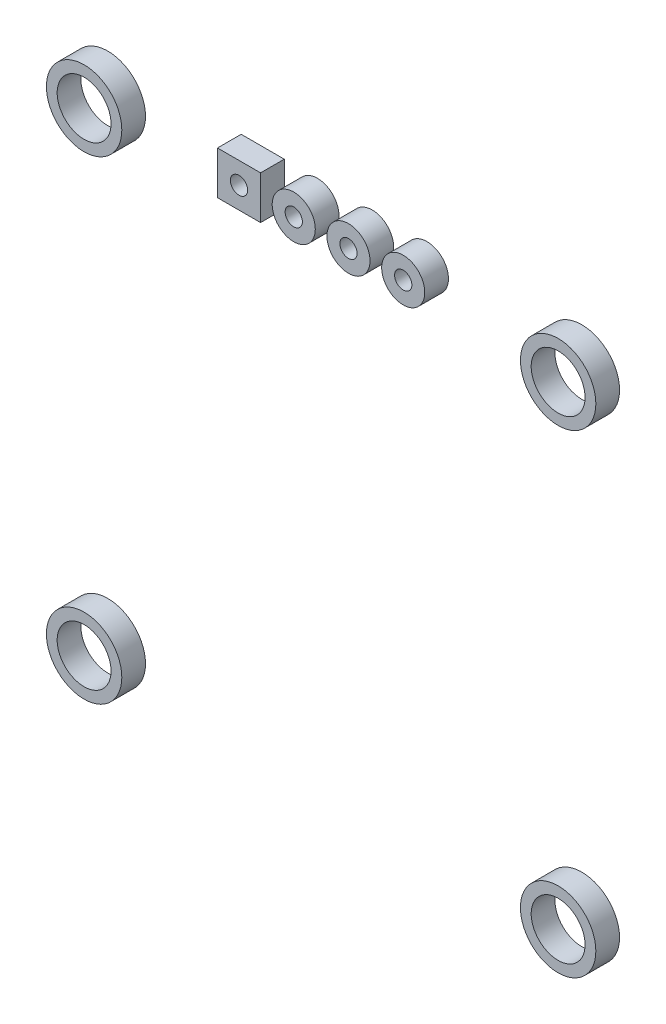
ISO-10303-21;
HEADER;
FILE_DESCRIPTION(('STEP AP214'),'2;1');
FILE_NAME('part.step','',(''),(''),'','','');
FILE_SCHEMA(('AUTOMOTIVE_DESIGN { 1 0 10303 214 1 1 1 1 }'));
ENDSEC;
DATA;
#1=APPLICATION_CONTEXT('core data for automotive mechanical design processes');
#2=APPLICATION_PROTOCOL_DEFINITION('international standard','automotive_design',2000,#1);
#3=PRODUCT_CONTEXT('',#1,'mechanical');
#4=PRODUCT('Part','Part','',(#3));
#5=PRODUCT_RELATED_PRODUCT_CATEGORY('part','',(#4));
#6=PRODUCT_DEFINITION_FORMATION('','',#4);
#7=PRODUCT_DEFINITION_CONTEXT('part definition',#1,'design');
#8=PRODUCT_DEFINITION('design','',#6,#7);
#9=PRODUCT_DEFINITION_SHAPE('','',#8);
#10=(LENGTH_UNIT() NAMED_UNIT(*) SI_UNIT(.MILLI.,.METRE.));
#11=(NAMED_UNIT(*) PLANE_ANGLE_UNIT() SI_UNIT($,.RADIAN.));
#12=(NAMED_UNIT(*) SI_UNIT($,.STERADIAN.) SOLID_ANGLE_UNIT());
#13=UNCERTAINTY_MEASURE_WITH_UNIT(LENGTH_MEASURE(1.E-05),#10,'distance_accuracy_value','');
#14=(GEOMETRIC_REPRESENTATION_CONTEXT(3) GLOBAL_UNCERTAINTY_ASSIGNED_CONTEXT((#13)) GLOBAL_UNIT_ASSIGNED_CONTEXT((#10,
#11,#12)) REPRESENTATION_CONTEXT('',''));
#15=CARTESIAN_POINT('',(0.,0.,0.));
#16=DIRECTION('',(0.,0.,1.));
#17=DIRECTION('',(1.,0.,0.));
#18=AXIS2_PLACEMENT_3D('',#15,#16,#17);
#19=CARTESIAN_POINT('',(-0.113336493286,3.892335302933,1.1));
#20=DIRECTION('',(0.,0.,1.));
#21=DIRECTION('',(1.,0.,0.));
#22=AXIS2_PLACEMENT_3D('',#19,#20,#21);
#23=PLANE('',#22);
#24=CARTESIAN_POINT('',(11.,-11.,1.1));
#25=DIRECTION('',(0.,0.,1.));
#26=DIRECTION('',(1.,0.,0.));
#27=AXIS2_PLACEMENT_3D('',#24,#25,#26);
#28=CIRCLE('',#27,1.25);
#29=CARTESIAN_POINT('',(12.25,-11.,1.1));
#30=VERTEX_POINT('',#29);
#31=EDGE_CURVE('P0_E22',#30,#30,#28,.T.);
#32=ORIENTED_EDGE('',*,*,#31,.F.);
#33=EDGE_LOOP('',(#32));
#34=FACE_BOUND('',#33,.T.);
#35=CARTESIAN_POINT('',(11.,-11.,1.1));
#36=DIRECTION('',(0.,0.,1.));
#37=DIRECTION('',(1.,0.,0.));
#38=AXIS2_PLACEMENT_3D('',#35,#36,#37);
#39=CIRCLE('',#38,1.75);
#40=CARTESIAN_POINT('',(12.75,-11.,1.1));
#41=VERTEX_POINT('',#40);
#42=EDGE_CURVE('P0_E33',#41,#41,#39,.T.);
#43=ORIENTED_EDGE('',*,*,#42,.T.);
#44=EDGE_LOOP('',(#43));
#45=FACE_BOUND('',#44,.T.);
#46=ADVANCED_FACE('P0_F15',(#34,#45),#23,.T.);
#47=CARTESIAN_POINT('',(-0.113336493286,3.892335302933,0.));
#48=DIRECTION('',(0.,0.,1.));
#49=DIRECTION('',(1.,0.,0.));
#50=AXIS2_PLACEMENT_3D('',#47,#48,#49);
#51=PLANE('',#50);
#52=CARTESIAN_POINT('',(11.,-11.,0.));
#53=DIRECTION('',(0.,0.,1.));
#54=DIRECTION('',(1.,0.,0.));
#55=AXIS2_PLACEMENT_3D('',#52,#53,#54);
#56=CIRCLE('',#55,1.25);
#57=CARTESIAN_POINT('',(12.25,-11.,0.));
#58=VERTEX_POINT('',#57);
#59=EDGE_CURVE('P0_E10',#58,#58,#56,.T.);
#60=ORIENTED_EDGE('',*,*,#59,.T.);
#61=EDGE_LOOP('',(#60));
#62=FACE_BOUND('',#61,.T.);
#63=CARTESIAN_POINT('',(11.,-11.,0.));
#64=DIRECTION('',(0.,0.,1.));
#65=DIRECTION('',(1.,0.,0.));
#66=AXIS2_PLACEMENT_3D('',#63,#64,#65);
#67=CIRCLE('',#66,1.75);
#68=CARTESIAN_POINT('',(12.75,-11.,0.));
#69=VERTEX_POINT('',#68);
#70=EDGE_CURVE('P0_E36',#69,#69,#67,.T.);
#71=ORIENTED_EDGE('',*,*,#70,.F.);
#72=EDGE_LOOP('',(#71));
#73=FACE_BOUND('',#72,.T.);
#74=ADVANCED_FACE('P0_F47',(#62,#73),#51,.F.);
#75=CARTESIAN_POINT('',(11.,-11.,0.));
#76=DIRECTION('',(0.,0.,-1.));
#77=DIRECTION('',(1.,0.,0.));
#78=AXIS2_PLACEMENT_3D('',#75,#76,#77);
#79=CYLINDRICAL_SURFACE('',#78,1.25);
#80=ORIENTED_EDGE('',*,*,#31,.T.);
#81=EDGE_LOOP('',(#80));
#82=FACE_BOUND('',#81,.T.);
#83=ORIENTED_EDGE('',*,*,#59,.F.);
#84=EDGE_LOOP('',(#83));
#85=FACE_BOUND('',#84,.T.);
#86=ADVANCED_FACE('P0_F51',(#82,#85),#79,.F.);
#87=CARTESIAN_POINT('',(11.,-11.,0.));
#88=DIRECTION('',(0.,0.,-1.));
#89=DIRECTION('',(1.,0.,0.));
#90=AXIS2_PLACEMENT_3D('',#87,#88,#89);
#91=CYLINDRICAL_SURFACE('',#90,1.75);
#92=ORIENTED_EDGE('',*,*,#42,.F.);
#93=EDGE_LOOP('',(#92));
#94=FACE_BOUND('',#93,.T.);
#95=ORIENTED_EDGE('',*,*,#70,.T.);
#96=EDGE_LOOP('',(#95));
#97=FACE_BOUND('',#96,.T.);
#98=ADVANCED_FACE('P0_F50',(#94,#97),#91,.T.);
#99=CLOSED_SHELL('',(#46,#74,#86,#98));
#100=MANIFOLD_SOLID_BREP('P0_B1',#99);
#101=CARTESIAN_POINT('',(-0.113336493286,3.892335302933,1.1));
#102=DIRECTION('',(0.,0.,1.));
#103=DIRECTION('',(1.,0.,0.));
#104=AXIS2_PLACEMENT_3D('',#101,#102,#103);
#105=PLANE('',#104);
#106=CARTESIAN_POINT('',(-11.,-11.,1.1));
#107=DIRECTION('',(0.,0.,1.));
#108=DIRECTION('',(1.,0.,0.));
#109=AXIS2_PLACEMENT_3D('',#106,#107,#108);
#110=CIRCLE('',#109,1.25);
#111=CARTESIAN_POINT('',(-9.75,-11.,1.1));
#112=VERTEX_POINT('',#111);
#113=EDGE_CURVE('P1_E23',#112,#112,#110,.T.);
#114=ORIENTED_EDGE('',*,*,#113,.F.);
#115=EDGE_LOOP('',(#114));
#116=FACE_BOUND('',#115,.T.);
#117=CARTESIAN_POINT('',(-11.,-11.,1.1));
#118=DIRECTION('',(0.,0.,1.));
#119=DIRECTION('',(1.,0.,0.));
#120=AXIS2_PLACEMENT_3D('',#117,#118,#119);
#121=CIRCLE('',#120,1.75);
#122=CARTESIAN_POINT('',(-9.25,-11.,1.1));
#123=VERTEX_POINT('',#122);
#124=EDGE_CURVE('P1_E18',#123,#123,#121,.T.);
#125=ORIENTED_EDGE('',*,*,#124,.T.);
#126=EDGE_LOOP('',(#125));
#127=FACE_BOUND('',#126,.T.);
#128=ADVANCED_FACE('P1_F15',(#116,#127),#105,.T.);
#129=CARTESIAN_POINT('',(-0.113336493286,3.892335302933,0.));
#130=DIRECTION('',(0.,0.,1.));
#131=DIRECTION('',(1.,0.,0.));
#132=AXIS2_PLACEMENT_3D('',#129,#130,#131);
#133=PLANE('',#132);
#134=CARTESIAN_POINT('',(-11.,-11.,0.));
#135=DIRECTION('',(0.,0.,1.));
#136=DIRECTION('',(1.,0.,0.));
#137=AXIS2_PLACEMENT_3D('',#134,#135,#136);
#138=CIRCLE('',#137,1.25);
#139=CARTESIAN_POINT('',(-9.75,-11.,0.));
#140=VERTEX_POINT('',#139);
#141=EDGE_CURVE('P1_E10',#140,#140,#138,.T.);
#142=ORIENTED_EDGE('',*,*,#141,.T.);
#143=EDGE_LOOP('',(#142));
#144=FACE_BOUND('',#143,.T.);
#145=CARTESIAN_POINT('',(-11.,-11.,0.));
#146=DIRECTION('',(0.,0.,1.));
#147=DIRECTION('',(1.,0.,0.));
#148=AXIS2_PLACEMENT_3D('',#145,#146,#147);
#149=CIRCLE('',#148,1.75);
#150=CARTESIAN_POINT('',(-9.25,-11.,0.));
#151=VERTEX_POINT('',#150);
#152=EDGE_CURVE('P1_E35',#151,#151,#149,.T.);
#153=ORIENTED_EDGE('',*,*,#152,.F.);
#154=EDGE_LOOP('',(#153));
#155=FACE_BOUND('',#154,.T.);
#156=ADVANCED_FACE('P1_F57',(#144,#155),#133,.F.);
#157=CARTESIAN_POINT('',(-11.,-11.,0.));
#158=DIRECTION('',(0.,0.,-1.));
#159=DIRECTION('',(1.,0.,0.));
#160=AXIS2_PLACEMENT_3D('',#157,#158,#159);
#161=CYLINDRICAL_SURFACE('',#160,1.25);
#162=ORIENTED_EDGE('',*,*,#113,.T.);
#163=EDGE_LOOP('',(#162));
#164=FACE_BOUND('',#163,.T.);
#165=ORIENTED_EDGE('',*,*,#141,.F.);
#166=EDGE_LOOP('',(#165));
#167=FACE_BOUND('',#166,.T.);
#168=ADVANCED_FACE('P1_F49',(#164,#167),#161,.F.);
#169=CARTESIAN_POINT('',(-11.,-11.,0.));
#170=DIRECTION('',(0.,0.,-1.));
#171=DIRECTION('',(1.,0.,0.));
#172=AXIS2_PLACEMENT_3D('',#169,#170,#171);
#173=CYLINDRICAL_SURFACE('',#172,1.75);
#174=ORIENTED_EDGE('',*,*,#124,.F.);
#175=EDGE_LOOP('',(#174));
#176=FACE_BOUND('',#175,.T.);
#177=ORIENTED_EDGE('',*,*,#152,.T.);
#178=EDGE_LOOP('',(#177));
#179=FACE_BOUND('',#178,.T.);
#180=ADVANCED_FACE('P1_F48',(#176,#179),#173,.T.);
#181=CLOSED_SHELL('',(#128,#156,#168,#180));
#182=MANIFOLD_SOLID_BREP('P1_B1',#181);
#183=CARTESIAN_POINT('',(-0.113336493286,3.892335302933,1.1));
#184=DIRECTION('',(0.,0.,1.));
#185=DIRECTION('',(1.,0.,0.));
#186=AXIS2_PLACEMENT_3D('',#183,#184,#185);
#187=PLANE('',#186);
#188=CARTESIAN_POINT('',(11.,11.,1.1));
#189=DIRECTION('',(0.,0.,1.));
#190=DIRECTION('',(1.,0.,0.));
#191=AXIS2_PLACEMENT_3D('',#188,#189,#190);
#192=CIRCLE('',#191,1.25);
#193=CARTESIAN_POINT('',(12.25,11.,1.1));
#194=VERTEX_POINT('',#193);
#195=EDGE_CURVE('P2_E18',#194,#194,#192,.T.);
#196=ORIENTED_EDGE('',*,*,#195,.F.);
#197=EDGE_LOOP('',(#196));
#198=FACE_BOUND('',#197,.T.);
#199=CARTESIAN_POINT('',(11.,11.,1.1));
#200=DIRECTION('',(0.,0.,1.));
#201=DIRECTION('',(1.,0.,0.));
#202=AXIS2_PLACEMENT_3D('',#199,#200,#201);
#203=CIRCLE('',#202,1.75);
#204=CARTESIAN_POINT('',(12.75,11.,1.1));
#205=VERTEX_POINT('',#204);
#206=EDGE_CURVE('P2_E33',#205,#205,#203,.T.);
#207=ORIENTED_EDGE('',*,*,#206,.T.);
#208=EDGE_LOOP('',(#207));
#209=FACE_BOUND('',#208,.T.);
#210=ADVANCED_FACE('P2_F15',(#198,#209),#187,.T.);
#211=CARTESIAN_POINT('',(-0.113336493286,3.892335302933,0.));
#212=DIRECTION('',(0.,0.,1.));
#213=DIRECTION('',(1.,0.,0.));
#214=AXIS2_PLACEMENT_3D('',#211,#212,#213);
#215=PLANE('',#214);
#216=CARTESIAN_POINT('',(11.,11.,0.));
#217=DIRECTION('',(0.,0.,1.));
#218=DIRECTION('',(1.,0.,0.));
#219=AXIS2_PLACEMENT_3D('',#216,#217,#218);
#220=CIRCLE('',#219,1.25);
#221=CARTESIAN_POINT('',(12.25,11.,0.));
#222=VERTEX_POINT('',#221);
#223=EDGE_CURVE('P2_E10',#222,#222,#220,.T.);
#224=ORIENTED_EDGE('',*,*,#223,.T.);
#225=EDGE_LOOP('',(#224));
#226=FACE_BOUND('',#225,.T.);
#227=CARTESIAN_POINT('',(11.,11.,0.));
#228=DIRECTION('',(0.,0.,1.));
#229=DIRECTION('',(1.,0.,0.));
#230=AXIS2_PLACEMENT_3D('',#227,#228,#229);
#231=CIRCLE('',#230,1.75);
#232=CARTESIAN_POINT('',(12.75,11.,0.));
#233=VERTEX_POINT('',#232);
#234=EDGE_CURVE('P2_E38',#233,#233,#231,.T.);
#235=ORIENTED_EDGE('',*,*,#234,.F.);
#236=EDGE_LOOP('',(#235));
#237=FACE_BOUND('',#236,.T.);
#238=ADVANCED_FACE('P2_F44',(#226,#237),#215,.F.);
#239=CARTESIAN_POINT('',(11.,11.,0.));
#240=DIRECTION('',(0.,0.,-1.));
#241=DIRECTION('',(1.,0.,0.));
#242=AXIS2_PLACEMENT_3D('',#239,#240,#241);
#243=CYLINDRICAL_SURFACE('',#242,1.25);
#244=ORIENTED_EDGE('',*,*,#195,.T.);
#245=EDGE_LOOP('',(#244));
#246=FACE_BOUND('',#245,.T.);
#247=ORIENTED_EDGE('',*,*,#223,.F.);
#248=EDGE_LOOP('',(#247));
#249=FACE_BOUND('',#248,.T.);
#250=ADVANCED_FACE('P2_F50',(#246,#249),#243,.F.);
#251=CARTESIAN_POINT('',(11.,11.,0.));
#252=DIRECTION('',(0.,0.,-1.));
#253=DIRECTION('',(1.,0.,0.));
#254=AXIS2_PLACEMENT_3D('',#251,#252,#253);
#255=CYLINDRICAL_SURFACE('',#254,1.75);
#256=ORIENTED_EDGE('',*,*,#206,.F.);
#257=EDGE_LOOP('',(#256));
#258=FACE_BOUND('',#257,.T.);
#259=ORIENTED_EDGE('',*,*,#234,.T.);
#260=EDGE_LOOP('',(#259));
#261=FACE_BOUND('',#260,.T.);
#262=ADVANCED_FACE('P2_F43',(#258,#261),#255,.T.);
#263=CLOSED_SHELL('',(#210,#238,#250,#262));
#264=MANIFOLD_SOLID_BREP('P2_B1',#263);
#265=CARTESIAN_POINT('',(-0.113336493286,3.892335302933,1.1));
#266=DIRECTION('',(0.,0.,1.));
#267=DIRECTION('',(1.,0.,0.));
#268=AXIS2_PLACEMENT_3D('',#265,#266,#267);
#269=PLANE('',#268);
#270=CARTESIAN_POINT('',(-11.,11.,1.1));
#271=DIRECTION('',(0.,0.,1.));
#272=DIRECTION('',(1.,0.,0.));
#273=AXIS2_PLACEMENT_3D('',#270,#271,#272);
#274=CIRCLE('',#273,1.25);
#275=CARTESIAN_POINT('',(-9.75,11.,1.1));
#276=VERTEX_POINT('',#275);
#277=EDGE_CURVE('P3_E22',#276,#276,#274,.T.);
#278=ORIENTED_EDGE('',*,*,#277,.F.);
#279=EDGE_LOOP('',(#278));
#280=FACE_BOUND('',#279,.T.);
#281=CARTESIAN_POINT('',(-11.,11.,1.1));
#282=DIRECTION('',(0.,0.,1.));
#283=DIRECTION('',(1.,0.,0.));
#284=AXIS2_PLACEMENT_3D('',#281,#282,#283);
#285=CIRCLE('',#284,1.75);
#286=CARTESIAN_POINT('',(-9.25,11.,1.1));
#287=VERTEX_POINT('',#286);
#288=EDGE_CURVE('P3_E33',#287,#287,#285,.T.);
#289=ORIENTED_EDGE('',*,*,#288,.T.);
#290=EDGE_LOOP('',(#289));
#291=FACE_BOUND('',#290,.T.);
#292=ADVANCED_FACE('P3_F15',(#280,#291),#269,.T.);
#293=CARTESIAN_POINT('',(-0.113336493286,3.892335302933,0.));
#294=DIRECTION('',(0.,0.,1.));
#295=DIRECTION('',(1.,0.,0.));
#296=AXIS2_PLACEMENT_3D('',#293,#294,#295);
#297=PLANE('',#296);
#298=CARTESIAN_POINT('',(-11.,11.,0.));
#299=DIRECTION('',(0.,0.,1.));
#300=DIRECTION('',(1.,0.,0.));
#301=AXIS2_PLACEMENT_3D('',#298,#299,#300);
#302=CIRCLE('',#301,1.25);
#303=CARTESIAN_POINT('',(-9.75,11.,0.));
#304=VERTEX_POINT('',#303);
#305=EDGE_CURVE('P3_E10',#304,#304,#302,.T.);
#306=ORIENTED_EDGE('',*,*,#305,.T.);
#307=EDGE_LOOP('',(#306));
#308=FACE_BOUND('',#307,.T.);
#309=CARTESIAN_POINT('',(-11.,11.,0.));
#310=DIRECTION('',(0.,0.,1.));
#311=DIRECTION('',(1.,0.,0.));
#312=AXIS2_PLACEMENT_3D('',#309,#310,#311);
#313=CIRCLE('',#312,1.75);
#314=CARTESIAN_POINT('',(-9.25,11.,0.));
#315=VERTEX_POINT('',#314);
#316=EDGE_CURVE('P3_E39',#315,#315,#313,.T.);
#317=ORIENTED_EDGE('',*,*,#316,.F.);
#318=EDGE_LOOP('',(#317));
#319=FACE_BOUND('',#318,.T.);
#320=ADVANCED_FACE('P3_F47',(#308,#319),#297,.F.);
#321=CARTESIAN_POINT('',(-11.,11.,0.));
#322=DIRECTION('',(0.,0.,-1.));
#323=DIRECTION('',(1.,0.,0.));
#324=AXIS2_PLACEMENT_3D('',#321,#322,#323);
#325=CYLINDRICAL_SURFACE('',#324,1.25);
#326=ORIENTED_EDGE('',*,*,#277,.T.);
#327=EDGE_LOOP('',(#326));
#328=FACE_BOUND('',#327,.T.);
#329=ORIENTED_EDGE('',*,*,#305,.F.);
#330=EDGE_LOOP('',(#329));
#331=FACE_BOUND('',#330,.T.);
#332=ADVANCED_FACE('P3_F51',(#328,#331),#325,.F.);
#333=CARTESIAN_POINT('',(-11.,11.,0.));
#334=DIRECTION('',(0.,0.,-1.));
#335=DIRECTION('',(1.,0.,0.));
#336=AXIS2_PLACEMENT_3D('',#333,#334,#335);
#337=CYLINDRICAL_SURFACE('',#336,1.75);
#338=ORIENTED_EDGE('',*,*,#288,.F.);
#339=EDGE_LOOP('',(#338));
#340=FACE_BOUND('',#339,.T.);
#341=ORIENTED_EDGE('',*,*,#316,.T.);
#342=EDGE_LOOP('',(#341));
#343=FACE_BOUND('',#342,.T.);
#344=ADVANCED_FACE('P3_F50',(#340,#343),#337,.T.);
#345=CLOSED_SHELL('',(#292,#320,#332,#344));
#346=MANIFOLD_SOLID_BREP('P3_B1',#345);
#347=CARTESIAN_POINT('',(-0.113336493286,3.892335302933,1.1));
#348=DIRECTION('',(0.,0.,1.));
#349=DIRECTION('',(1.,0.,0.));
#350=AXIS2_PLACEMENT_3D('',#347,#348,#349);
#351=PLANE('',#350);
#352=CARTESIAN_POINT('',(3.81,11.5,1.1));
#353=DIRECTION('',(0.,0.,1.));
#354=DIRECTION('',(1.,0.,0.));
#355=AXIS2_PLACEMENT_3D('',#352,#353,#354);
#356=CIRCLE('',#355,0.4);
#357=CARTESIAN_POINT('',(4.21,11.5,1.1));
#358=VERTEX_POINT('',#357);
#359=EDGE_CURVE('P4_E22',#358,#358,#356,.T.);
#360=ORIENTED_EDGE('',*,*,#359,.F.);
#361=EDGE_LOOP('',(#360));
#362=FACE_BOUND('',#361,.T.);
#363=CARTESIAN_POINT('',(3.81,11.5,1.1));
#364=DIRECTION('',(0.,0.,1.));
#365=DIRECTION('',(1.,0.,0.));
#366=AXIS2_PLACEMENT_3D('',#363,#364,#365);
#367=CIRCLE('',#366,1.);
#368=CARTESIAN_POINT('',(4.81,11.5,1.1));
#369=VERTEX_POINT('',#368);
#370=EDGE_CURVE('P4_E33',#369,#369,#367,.T.);
#371=ORIENTED_EDGE('',*,*,#370,.T.);
#372=EDGE_LOOP('',(#371));
#373=FACE_BOUND('',#372,.T.);
#374=ADVANCED_FACE('P4_F15',(#362,#373),#351,.T.);
#375=CARTESIAN_POINT('',(-0.113336493286,3.892335302933,0.));
#376=DIRECTION('',(0.,0.,1.));
#377=DIRECTION('',(1.,0.,0.));
#378=AXIS2_PLACEMENT_3D('',#375,#376,#377);
#379=PLANE('',#378);
#380=CARTESIAN_POINT('',(3.81,11.5,0.));
#381=DIRECTION('',(0.,0.,1.));
#382=DIRECTION('',(1.,0.,0.));
#383=AXIS2_PLACEMENT_3D('',#380,#381,#382);
#384=CIRCLE('',#383,0.4);
#385=CARTESIAN_POINT('',(4.21,11.5,0.));
#386=VERTEX_POINT('',#385);
#387=EDGE_CURVE('P4_E10',#386,#386,#384,.T.);
#388=ORIENTED_EDGE('',*,*,#387,.T.);
#389=EDGE_LOOP('',(#388));
#390=FACE_BOUND('',#389,.T.);
#391=CARTESIAN_POINT('',(3.81,11.5,0.));
#392=DIRECTION('',(0.,0.,1.));
#393=DIRECTION('',(1.,0.,0.));
#394=AXIS2_PLACEMENT_3D('',#391,#392,#393);
#395=CIRCLE('',#394,1.);
#396=CARTESIAN_POINT('',(4.81,11.5,0.));
#397=VERTEX_POINT('',#396);
#398=EDGE_CURVE('P4_E36',#397,#397,#395,.T.);
#399=ORIENTED_EDGE('',*,*,#398,.F.);
#400=EDGE_LOOP('',(#399));
#401=FACE_BOUND('',#400,.T.);
#402=ADVANCED_FACE('P4_F47',(#390,#401),#379,.F.);
#403=CARTESIAN_POINT('',(3.81,11.5,0.));
#404=DIRECTION('',(0.,0.,-1.));
#405=DIRECTION('',(1.,0.,0.));
#406=AXIS2_PLACEMENT_3D('',#403,#404,#405);
#407=CYLINDRICAL_SURFACE('',#406,0.4);
#408=ORIENTED_EDGE('',*,*,#359,.T.);
#409=EDGE_LOOP('',(#408));
#410=FACE_BOUND('',#409,.T.);
#411=ORIENTED_EDGE('',*,*,#387,.F.);
#412=EDGE_LOOP('',(#411));
#413=FACE_BOUND('',#412,.T.);
#414=ADVANCED_FACE('P4_F51',(#410,#413),#407,.F.);
#415=CARTESIAN_POINT('',(3.81,11.5,0.));
#416=DIRECTION('',(0.,0.,-1.));
#417=DIRECTION('',(1.,0.,0.));
#418=AXIS2_PLACEMENT_3D('',#415,#416,#417);
#419=CYLINDRICAL_SURFACE('',#418,1.);
#420=ORIENTED_EDGE('',*,*,#370,.F.);
#421=EDGE_LOOP('',(#420));
#422=FACE_BOUND('',#421,.T.);
#423=ORIENTED_EDGE('',*,*,#398,.T.);
#424=EDGE_LOOP('',(#423));
#425=FACE_BOUND('',#424,.T.);
#426=ADVANCED_FACE('P4_F50',(#422,#425),#419,.T.);
#427=CLOSED_SHELL('',(#374,#402,#414,#426));
#428=MANIFOLD_SOLID_BREP('P4_B1',#427);
#429=CARTESIAN_POINT('',(-0.113336493286,3.892335302933,1.1));
#430=DIRECTION('',(0.,0.,1.));
#431=DIRECTION('',(1.,0.,0.));
#432=AXIS2_PLACEMENT_3D('',#429,#430,#431);
#433=PLANE('',#432);
#434=CARTESIAN_POINT('',(-3.81,11.5,1.1));
#435=DIRECTION('',(0.,0.,1.));
#436=DIRECTION('',(1.,0.,0.));
#437=AXIS2_PLACEMENT_3D('',#434,#435,#436);
#438=CIRCLE('',#437,0.4);
#439=CARTESIAN_POINT('',(-3.41,11.5,1.1));
#440=VERTEX_POINT('',#439);
#441=EDGE_CURVE('P5_E27',#440,#440,#438,.T.);
#442=ORIENTED_EDGE('',*,*,#441,.F.);
#443=EDGE_LOOP('',(#442));
#444=FACE_BOUND('',#443,.T.);
#445=DIRECTION('',(0.,1.,0.));
#446=VECTOR('',#445,1.);
#447=CARTESIAN_POINT('',(-4.81,10.5,1.1));
#448=LINE('',#447,#446);
#449=CARTESIAN_POINT('',(-4.81,10.5,1.1));
#450=VERTEX_POINT('',#449);
#451=CARTESIAN_POINT('',(-4.81,12.5,1.1));
#452=VERTEX_POINT('',#451);
#453=EDGE_CURVE('P5_E48',#450,#452,#448,.T.);
#454=ORIENTED_EDGE('',*,*,#453,.F.);
#455=DIRECTION('',(-1.,0.,0.));
#456=VECTOR('',#455,1.);
#457=CARTESIAN_POINT('',(-2.81,10.5,1.1));
#458=LINE('',#457,#456);
#459=CARTESIAN_POINT('',(-2.81,10.5,1.1));
#460=VERTEX_POINT('',#459);
#461=EDGE_CURVE('P5_E75',#460,#450,#458,.T.);
#462=ORIENTED_EDGE('',*,*,#461,.F.);
#463=DIRECTION('',(0.,-1.,0.));
#464=VECTOR('',#463,1.);
#465=CARTESIAN_POINT('',(-2.81,12.5,1.1));
#466=LINE('',#465,#464);
#467=CARTESIAN_POINT('',(-2.81,12.5,1.1));
#468=VERTEX_POINT('',#467);
#469=EDGE_CURVE('P5_E72',#468,#460,#466,.T.);
#470=ORIENTED_EDGE('',*,*,#469,.F.);
#471=DIRECTION('',(1.,0.,0.));
#472=VECTOR('',#471,1.);
#473=CARTESIAN_POINT('',(-4.81,12.5,1.1));
#474=LINE('',#473,#472);
#475=EDGE_CURVE('P5_E128',#452,#468,#474,.T.);
#476=ORIENTED_EDGE('',*,*,#475,.F.);
#477=EDGE_LOOP('',(#454,#462,#470,#476));
#478=FACE_BOUND('',#477,.T.);
#479=ADVANCED_FACE('P5_F17',(#444,#478),#433,.T.);
#480=CARTESIAN_POINT('',(-0.113336493286,3.892335302933,0.));
#481=DIRECTION('',(0.,0.,1.));
#482=DIRECTION('',(1.,0.,0.));
#483=AXIS2_PLACEMENT_3D('',#480,#481,#482);
#484=PLANE('',#483);
#485=CARTESIAN_POINT('',(-3.81,11.5,0.));
#486=DIRECTION('',(0.,0.,1.));
#487=DIRECTION('',(1.,0.,0.));
#488=AXIS2_PLACEMENT_3D('',#485,#486,#487);
#489=CIRCLE('',#488,0.4);
#490=CARTESIAN_POINT('',(-3.41,11.5,0.));
#491=VERTEX_POINT('',#490);
#492=EDGE_CURVE('P5_E11',#491,#491,#489,.T.);
#493=ORIENTED_EDGE('',*,*,#492,.T.);
#494=EDGE_LOOP('',(#493));
#495=FACE_BOUND('',#494,.T.);
#496=DIRECTION('',(1.,0.,0.));
#497=VECTOR('',#496,1.);
#498=CARTESIAN_POINT('',(-4.81,12.5,0.));
#499=LINE('',#498,#497);
#500=CARTESIAN_POINT('',(-4.81,12.5,0.));
#501=VERTEX_POINT('',#500);
#502=CARTESIAN_POINT('',(-2.81,12.5,0.));
#503=VERTEX_POINT('',#502);
#504=EDGE_CURVE('P5_E92',#501,#503,#499,.T.);
#505=ORIENTED_EDGE('',*,*,#504,.T.);
#506=DIRECTION('',(0.,-1.,0.));
#507=VECTOR('',#506,1.);
#508=CARTESIAN_POINT('',(-2.81,12.5,0.));
#509=LINE('',#508,#507);
#510=CARTESIAN_POINT('',(-2.81,10.5,0.));
#511=VERTEX_POINT('',#510);
#512=EDGE_CURVE('P5_E79',#503,#511,#509,.T.);
#513=ORIENTED_EDGE('',*,*,#512,.T.);
#514=DIRECTION('',(-1.,0.,0.));
#515=VECTOR('',#514,1.);
#516=CARTESIAN_POINT('',(-2.81,10.5,0.));
#517=LINE('',#516,#515);
#518=CARTESIAN_POINT('',(-4.81,10.5,0.));
#519=VERTEX_POINT('',#518);
#520=EDGE_CURVE('P5_E84',#511,#519,#517,.T.);
#521=ORIENTED_EDGE('',*,*,#520,.T.);
#522=DIRECTION('',(0.,1.,0.));
#523=VECTOR('',#522,1.);
#524=CARTESIAN_POINT('',(-4.81,10.5,0.));
#525=LINE('',#524,#523);
#526=EDGE_CURVE('P5_E20',#519,#501,#525,.T.);
#527=ORIENTED_EDGE('',*,*,#526,.T.);
#528=EDGE_LOOP('',(#505,#513,#521,#527));
#529=FACE_BOUND('',#528,.T.);
#530=ADVANCED_FACE('P5_F121',(#495,#529),#484,.F.);
#531=CARTESIAN_POINT('',(-3.81,11.5,0.));
#532=DIRECTION('',(0.,0.,-1.));
#533=DIRECTION('',(1.,0.,0.));
#534=AXIS2_PLACEMENT_3D('',#531,#532,#533);
#535=CYLINDRICAL_SURFACE('',#534,0.4);
#536=ORIENTED_EDGE('',*,*,#441,.T.);
#537=EDGE_LOOP('',(#536));
#538=FACE_BOUND('',#537,.T.);
#539=ORIENTED_EDGE('',*,*,#492,.F.);
#540=EDGE_LOOP('',(#539));
#541=FACE_BOUND('',#540,.T.);
#542=ADVANCED_FACE('P5_F183',(#538,#541),#535,.F.);
#543=CARTESIAN_POINT('',(-4.81,10.5,0.));
#544=DIRECTION('',(-1.,0.,0.));
#545=DIRECTION('',(0.,0.,1.));
#546=AXIS2_PLACEMENT_3D('',#543,#544,#545);
#547=PLANE('',#546);
#548=DIRECTION('',(0.,0.,1.));
#549=VECTOR('',#548,1.);
#550=CARTESIAN_POINT('',(-4.81,10.5,0.));
#551=LINE('',#550,#549);
#552=EDGE_CURVE('P5_E78',#519,#450,#551,.T.);
#553=ORIENTED_EDGE('',*,*,#552,.T.);
#554=ORIENTED_EDGE('',*,*,#453,.T.);
#555=DIRECTION('',(0.,0.,1.));
#556=VECTOR('',#555,1.);
#557=CARTESIAN_POINT('',(-4.81,12.5,0.));
#558=LINE('',#557,#556);
#559=EDGE_CURVE('P5_E124',#501,#452,#558,.T.);
#560=ORIENTED_EDGE('',*,*,#559,.F.);
#561=ORIENTED_EDGE('',*,*,#526,.F.);
#562=EDGE_LOOP('',(#553,#554,#560,#561));
#563=FACE_BOUND('',#562,.T.);
#564=ADVANCED_FACE('P5_F130',(#563),#547,.T.);
#565=CARTESIAN_POINT('',(-2.81,10.5,0.));
#566=DIRECTION('',(0.,-1.,0.));
#567=DIRECTION('',(0.,0.,-1.));
#568=AXIS2_PLACEMENT_3D('',#565,#566,#567);
#569=PLANE('',#568);
#570=DIRECTION('',(0.,0.,1.));
#571=VECTOR('',#570,1.);
#572=CARTESIAN_POINT('',(-2.81,10.5,0.));
#573=LINE('',#572,#571);
#574=EDGE_CURVE('P5_E83',#511,#460,#573,.T.);
#575=ORIENTED_EDGE('',*,*,#574,.T.);
#576=ORIENTED_EDGE('',*,*,#461,.T.);
#577=ORIENTED_EDGE('',*,*,#552,.F.);
#578=ORIENTED_EDGE('',*,*,#520,.F.);
#579=EDGE_LOOP('',(#575,#576,#577,#578));
#580=FACE_BOUND('',#579,.T.);
#581=ADVANCED_FACE('P5_F82',(#580),#569,.T.);
#582=CARTESIAN_POINT('',(-2.81,12.5,0.));
#583=DIRECTION('',(1.,0.,0.));
#584=DIRECTION('',(0.,1.,0.));
#585=AXIS2_PLACEMENT_3D('',#582,#583,#584);
#586=PLANE('',#585);
#587=DIRECTION('',(0.,0.,1.));
#588=VECTOR('',#587,1.);
#589=CARTESIAN_POINT('',(-2.81,12.5,0.));
#590=LINE('',#589,#588);
#591=EDGE_CURVE('P5_E95',#503,#468,#590,.T.);
#592=ORIENTED_EDGE('',*,*,#591,.T.);
#593=ORIENTED_EDGE('',*,*,#469,.T.);
#594=ORIENTED_EDGE('',*,*,#574,.F.);
#595=ORIENTED_EDGE('',*,*,#512,.F.);
#596=EDGE_LOOP('',(#592,#593,#594,#595));
#597=FACE_BOUND('',#596,.T.);
#598=ADVANCED_FACE('P5_F89',(#597),#586,.T.);
#599=CARTESIAN_POINT('',(-4.81,12.5,0.));
#600=DIRECTION('',(0.,1.,0.));
#601=DIRECTION('',(1.,0.,0.));
#602=AXIS2_PLACEMENT_3D('',#599,#600,#601);
#603=PLANE('',#602);
#604=ORIENTED_EDGE('',*,*,#559,.T.);
#605=ORIENTED_EDGE('',*,*,#475,.T.);
#606=ORIENTED_EDGE('',*,*,#591,.F.);
#607=ORIENTED_EDGE('',*,*,#504,.F.);
#608=EDGE_LOOP('',(#604,#605,#606,#607));
#609=FACE_BOUND('',#608,.T.);
#610=ADVANCED_FACE('P5_F122',(#609),#603,.T.);
#611=CLOSED_SHELL('',(#479,#530,#542,#564,#581,#598,#610));
#612=MANIFOLD_SOLID_BREP('P5_B1',#611);
#613=CARTESIAN_POINT('',(-0.113336493286,3.892335302933,1.1));
#614=DIRECTION('',(0.,0.,1.));
#615=DIRECTION('',(1.,0.,0.));
#616=AXIS2_PLACEMENT_3D('',#613,#614,#615);
#617=PLANE('',#616);
#618=CARTESIAN_POINT('',(-1.27,11.5,1.1));
#619=DIRECTION('',(0.,0.,1.));
#620=DIRECTION('',(1.,0.,0.));
#621=AXIS2_PLACEMENT_3D('',#618,#619,#620);
#622=CIRCLE('',#621,0.4);
#623=CARTESIAN_POINT('',(-0.87,11.5,1.1));
#624=VERTEX_POINT('',#623);
#625=EDGE_CURVE('P6_E22',#624,#624,#622,.T.);
#626=ORIENTED_EDGE('',*,*,#625,.F.);
#627=EDGE_LOOP('',(#626));
#628=FACE_BOUND('',#627,.T.);
#629=CARTESIAN_POINT('',(-1.27,11.5,1.1));
#630=DIRECTION('',(0.,0.,1.));
#631=DIRECTION('',(1.,0.,0.));
#632=AXIS2_PLACEMENT_3D('',#629,#630,#631);
#633=CIRCLE('',#632,1.);
#634=CARTESIAN_POINT('',(-0.27,11.5,1.1));
#635=VERTEX_POINT('',#634);
#636=EDGE_CURVE('P6_E33',#635,#635,#633,.T.);
#637=ORIENTED_EDGE('',*,*,#636,.T.);
#638=EDGE_LOOP('',(#637));
#639=FACE_BOUND('',#638,.T.);
#640=ADVANCED_FACE('P6_F15',(#628,#639),#617,.T.);
#641=CARTESIAN_POINT('',(-0.113336493286,3.892335302933,0.));
#642=DIRECTION('',(0.,0.,1.));
#643=DIRECTION('',(1.,0.,0.));
#644=AXIS2_PLACEMENT_3D('',#641,#642,#643);
#645=PLANE('',#644);
#646=CARTESIAN_POINT('',(-1.27,11.5,0.));
#647=DIRECTION('',(0.,0.,1.));
#648=DIRECTION('',(1.,0.,0.));
#649=AXIS2_PLACEMENT_3D('',#646,#647,#648);
#650=CIRCLE('',#649,0.4);
#651=CARTESIAN_POINT('',(-0.87,11.5,0.));
#652=VERTEX_POINT('',#651);
#653=EDGE_CURVE('P6_E10',#652,#652,#650,.T.);
#654=ORIENTED_EDGE('',*,*,#653,.T.);
#655=EDGE_LOOP('',(#654));
#656=FACE_BOUND('',#655,.T.);
#657=CARTESIAN_POINT('',(-1.27,11.5,0.));
#658=DIRECTION('',(0.,0.,1.));
#659=DIRECTION('',(1.,0.,0.));
#660=AXIS2_PLACEMENT_3D('',#657,#658,#659);
#661=CIRCLE('',#660,1.);
#662=CARTESIAN_POINT('',(-0.27,11.5,0.));
#663=VERTEX_POINT('',#662);
#664=EDGE_CURVE('P6_E36',#663,#663,#661,.T.);
#665=ORIENTED_EDGE('',*,*,#664,.F.);
#666=EDGE_LOOP('',(#665));
#667=FACE_BOUND('',#666,.T.);
#668=ADVANCED_FACE('P6_F47',(#656,#667),#645,.F.);
#669=CARTESIAN_POINT('',(-1.27,11.5,0.));
#670=DIRECTION('',(0.,0.,-1.));
#671=DIRECTION('',(1.,0.,0.));
#672=AXIS2_PLACEMENT_3D('',#669,#670,#671);
#673=CYLINDRICAL_SURFACE('',#672,0.4);
#674=ORIENTED_EDGE('',*,*,#625,.T.);
#675=EDGE_LOOP('',(#674));
#676=FACE_BOUND('',#675,.T.);
#677=ORIENTED_EDGE('',*,*,#653,.F.);
#678=EDGE_LOOP('',(#677));
#679=FACE_BOUND('',#678,.T.);
#680=ADVANCED_FACE('P6_F51',(#676,#679),#673,.F.);
#681=CARTESIAN_POINT('',(-1.27,11.5,0.));
#682=DIRECTION('',(0.,0.,-1.));
#683=DIRECTION('',(1.,0.,0.));
#684=AXIS2_PLACEMENT_3D('',#681,#682,#683);
#685=CYLINDRICAL_SURFACE('',#684,1.);
#686=ORIENTED_EDGE('',*,*,#636,.F.);
#687=EDGE_LOOP('',(#686));
#688=FACE_BOUND('',#687,.T.);
#689=ORIENTED_EDGE('',*,*,#664,.T.);
#690=EDGE_LOOP('',(#689));
#691=FACE_BOUND('',#690,.T.);
#692=ADVANCED_FACE('P6_F50',(#688,#691),#685,.T.);
#693=CLOSED_SHELL('',(#640,#668,#680,#692));
#694=MANIFOLD_SOLID_BREP('P6_B1',#693);
#695=CARTESIAN_POINT('',(-0.113336493286,3.892335302933,1.1));
#696=DIRECTION('',(0.,0.,1.));
#697=DIRECTION('',(1.,0.,0.));
#698=AXIS2_PLACEMENT_3D('',#695,#696,#697);
#699=PLANE('',#698);
#700=CARTESIAN_POINT('',(1.27,11.5,1.1));
#701=DIRECTION('',(0.,0.,1.));
#702=DIRECTION('',(1.,0.,0.));
#703=AXIS2_PLACEMENT_3D('',#700,#701,#702);
#704=CIRCLE('',#703,0.4);
#705=CARTESIAN_POINT('',(1.67,11.5,1.1));
#706=VERTEX_POINT('',#705);
#707=EDGE_CURVE('P7_E22',#706,#706,#704,.T.);
#708=ORIENTED_EDGE('',*,*,#707,.F.);
#709=EDGE_LOOP('',(#708));
#710=FACE_BOUND('',#709,.T.);
#711=CARTESIAN_POINT('',(1.27,11.5,1.1));
#712=DIRECTION('',(0.,0.,1.));
#713=DIRECTION('',(1.,0.,0.));
#714=AXIS2_PLACEMENT_3D('',#711,#712,#713);
#715=CIRCLE('',#714,1.);
#716=CARTESIAN_POINT('',(2.27,11.5,1.1));
#717=VERTEX_POINT('',#716);
#718=EDGE_CURVE('P7_E33',#717,#717,#715,.T.);
#719=ORIENTED_EDGE('',*,*,#718,.T.);
#720=EDGE_LOOP('',(#719));
#721=FACE_BOUND('',#720,.T.);
#722=ADVANCED_FACE('P7_F15',(#710,#721),#699,.T.);
#723=CARTESIAN_POINT('',(-0.113336493286,3.892335302933,0.));
#724=DIRECTION('',(0.,0.,1.));
#725=DIRECTION('',(1.,0.,0.));
#726=AXIS2_PLACEMENT_3D('',#723,#724,#725);
#727=PLANE('',#726);
#728=CARTESIAN_POINT('',(1.27,11.5,0.));
#729=DIRECTION('',(0.,0.,1.));
#730=DIRECTION('',(1.,0.,0.));
#731=AXIS2_PLACEMENT_3D('',#728,#729,#730);
#732=CIRCLE('',#731,0.4);
#733=CARTESIAN_POINT('',(1.67,11.5,0.));
#734=VERTEX_POINT('',#733);
#735=EDGE_CURVE('P7_E10',#734,#734,#732,.T.);
#736=ORIENTED_EDGE('',*,*,#735,.T.);
#737=EDGE_LOOP('',(#736));
#738=FACE_BOUND('',#737,.T.);
#739=CARTESIAN_POINT('',(1.27,11.5,0.));
#740=DIRECTION('',(0.,0.,1.));
#741=DIRECTION('',(1.,0.,0.));
#742=AXIS2_PLACEMENT_3D('',#739,#740,#741);
#743=CIRCLE('',#742,1.);
#744=CARTESIAN_POINT('',(2.27,11.5,0.));
#745=VERTEX_POINT('',#744);
#746=EDGE_CURVE('P7_E36',#745,#745,#743,.T.);
#747=ORIENTED_EDGE('',*,*,#746,.F.);
#748=EDGE_LOOP('',(#747));
#749=FACE_BOUND('',#748,.T.);
#750=ADVANCED_FACE('P7_F47',(#738,#749),#727,.F.);
#751=CARTESIAN_POINT('',(1.27,11.5,0.));
#752=DIRECTION('',(0.,0.,-1.));
#753=DIRECTION('',(1.,0.,0.));
#754=AXIS2_PLACEMENT_3D('',#751,#752,#753);
#755=CYLINDRICAL_SURFACE('',#754,0.4);
#756=ORIENTED_EDGE('',*,*,#707,.T.);
#757=EDGE_LOOP('',(#756));
#758=FACE_BOUND('',#757,.T.);
#759=ORIENTED_EDGE('',*,*,#735,.F.);
#760=EDGE_LOOP('',(#759));
#761=FACE_BOUND('',#760,.T.);
#762=ADVANCED_FACE('P7_F51',(#758,#761),#755,.F.);
#763=CARTESIAN_POINT('',(1.27,11.5,0.));
#764=DIRECTION('',(0.,0.,-1.));
#765=DIRECTION('',(1.,0.,0.));
#766=AXIS2_PLACEMENT_3D('',#763,#764,#765);
#767=CYLINDRICAL_SURFACE('',#766,1.);
#768=ORIENTED_EDGE('',*,*,#718,.F.);
#769=EDGE_LOOP('',(#768));
#770=FACE_BOUND('',#769,.T.);
#771=ORIENTED_EDGE('',*,*,#746,.T.);
#772=EDGE_LOOP('',(#771));
#773=FACE_BOUND('',#772,.T.);
#774=ADVANCED_FACE('P7_F50',(#770,#773),#767,.T.);
#775=CLOSED_SHELL('',(#722,#750,#762,#774));
#776=MANIFOLD_SOLID_BREP('P7_B1',#775);
#777=ADVANCED_BREP_SHAPE_REPRESENTATION('',(#18,#100,#182,#264,#346,#428,#612,#694,#776),#14);
#778=SHAPE_DEFINITION_REPRESENTATION(#9,#777);
ENDSEC;
END-ISO-10303-21;
